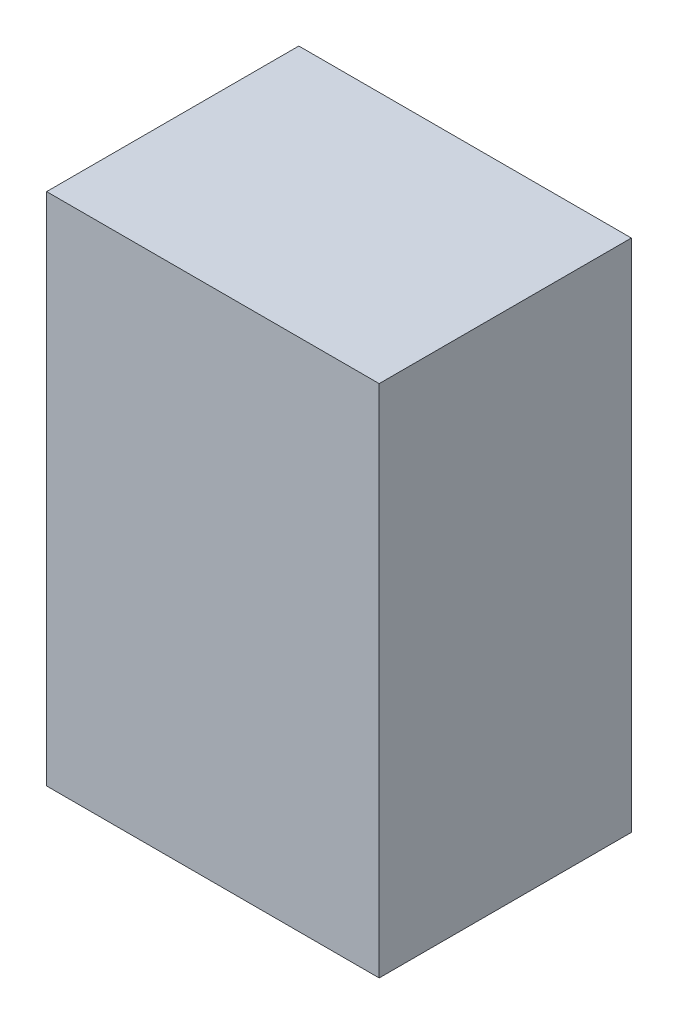
ISO-10303-21;
HEADER;
FILE_DESCRIPTION(('STEP AP214'),'2;1');
FILE_NAME('part.step','',(''),(''),'','','');
FILE_SCHEMA(('AUTOMOTIVE_DESIGN { 1 0 10303 214 1 1 1 1 }'));
ENDSEC;
DATA;
#1=APPLICATION_CONTEXT('core data for automotive mechanical design processes');
#2=APPLICATION_PROTOCOL_DEFINITION('international standard','automotive_design',2000,#1);
#3=PRODUCT_CONTEXT('',#1,'mechanical');
#4=PRODUCT('Part','Part','',(#3));
#5=PRODUCT_RELATED_PRODUCT_CATEGORY('part','',(#4));
#6=PRODUCT_DEFINITION_FORMATION('','',#4);
#7=PRODUCT_DEFINITION_CONTEXT('part definition',#1,'design');
#8=PRODUCT_DEFINITION('design','',#6,#7);
#9=PRODUCT_DEFINITION_SHAPE('','',#8);
#10=(LENGTH_UNIT() NAMED_UNIT(*) SI_UNIT(.MILLI.,.METRE.));
#11=(NAMED_UNIT(*) PLANE_ANGLE_UNIT() SI_UNIT($,.RADIAN.));
#12=(NAMED_UNIT(*) SI_UNIT($,.STERADIAN.) SOLID_ANGLE_UNIT());
#13=UNCERTAINTY_MEASURE_WITH_UNIT(LENGTH_MEASURE(1.E-05),#10,'distance_accuracy_value','');
#14=(GEOMETRIC_REPRESENTATION_CONTEXT(3) GLOBAL_UNCERTAINTY_ASSIGNED_CONTEXT((#13)) GLOBAL_UNIT_ASSIGNED_CONTEXT((#10,
#11,#12)) REPRESENTATION_CONTEXT('',''));
#15=CARTESIAN_POINT('',(0.,0.,0.));
#16=DIRECTION('',(0.,0.,1.));
#17=DIRECTION('',(1.,0.,0.));
#18=AXIS2_PLACEMENT_3D('',#15,#16,#17);
#19=CARTESIAN_POINT('',(-121.92,-188.722,184.912));
#20=DIRECTION('',(1.,0.,0.));
#21=DIRECTION('',(0.,0.,-1.));
#22=AXIS2_PLACEMENT_3D('',#19,#20,#21);
#23=PLANE('',#22);
#24=DIRECTION('',(0.,-1.,0.));
#25=VECTOR('',#24,1.);
#26=CARTESIAN_POINT('',(-121.92,-188.722,0.));
#27=LINE('',#26,#25);
#28=CARTESIAN_POINT('',(-121.92,188.722,0.));
#29=VERTEX_POINT('',#28);
#30=CARTESIAN_POINT('',(-121.92,-188.722,0.));
#31=VERTEX_POINT('',#30);
#32=EDGE_CURVE('E107',#29,#31,#27,.T.);
#33=ORIENTED_EDGE('',*,*,#32,.T.);
#34=DIRECTION('',(0.,0.,-1.));
#35=VECTOR('',#34,1.);
#36=CARTESIAN_POINT('',(-121.92,-188.722,184.912));
#37=LINE('',#36,#35);
#38=CARTESIAN_POINT('',(-121.92,-188.722,184.912));
#39=VERTEX_POINT('',#38);
#40=EDGE_CURVE('E11',#39,#31,#37,.T.);
#41=ORIENTED_EDGE('',*,*,#40,.F.);
#42=DIRECTION('',(0.,-1.,0.));
#43=VECTOR('',#42,1.);
#44=CARTESIAN_POINT('',(-121.92,-188.722,184.912));
#45=LINE('',#44,#43);
#46=CARTESIAN_POINT('',(-121.92,188.722,184.912));
#47=VERTEX_POINT('',#46);
#48=EDGE_CURVE('E91',#47,#39,#45,.T.);
#49=ORIENTED_EDGE('',*,*,#48,.F.);
#50=DIRECTION('',(0.,0.,-1.));
#51=VECTOR('',#50,1.);
#52=CARTESIAN_POINT('',(-121.92,188.722,184.912));
#53=LINE('',#52,#51);
#54=EDGE_CURVE('E103',#47,#29,#53,.T.);
#55=ORIENTED_EDGE('',*,*,#54,.T.);
#56=EDGE_LOOP('',(#33,#41,#49,#55));
#57=FACE_BOUND('',#56,.T.);
#58=ADVANCED_FACE('F39',(#57),#23,.F.);
#59=CARTESIAN_POINT('',(121.92,-188.722,184.912));
#60=DIRECTION('',(0.,1.,0.));
#61=DIRECTION('',(-1.,0.,0.));
#62=AXIS2_PLACEMENT_3D('',#59,#60,#61);
#63=PLANE('',#62);
#64=DIRECTION('',(1.,0.,0.));
#65=VECTOR('',#64,1.);
#66=CARTESIAN_POINT('',(121.92,-188.722,0.));
#67=LINE('',#66,#65);
#68=CARTESIAN_POINT('',(121.92,-188.722,0.));
#69=VERTEX_POINT('',#68);
#70=EDGE_CURVE('E96',#31,#69,#67,.T.);
#71=ORIENTED_EDGE('',*,*,#70,.T.);
#72=DIRECTION('',(0.,0.,-1.));
#73=VECTOR('',#72,1.);
#74=CARTESIAN_POINT('',(121.92,-188.722,184.912));
#75=LINE('',#74,#73);
#76=CARTESIAN_POINT('',(121.92,-188.722,184.912));
#77=VERTEX_POINT('',#76);
#78=EDGE_CURVE('E48',#77,#69,#75,.T.);
#79=ORIENTED_EDGE('',*,*,#78,.F.);
#80=DIRECTION('',(1.,0.,0.));
#81=VECTOR('',#80,1.);
#82=CARTESIAN_POINT('',(121.92,-188.722,184.912));
#83=LINE('',#82,#81);
#84=EDGE_CURVE('E86',#39,#77,#83,.T.);
#85=ORIENTED_EDGE('',*,*,#84,.F.);
#86=ORIENTED_EDGE('',*,*,#40,.T.);
#87=EDGE_LOOP('',(#71,#79,#85,#86));
#88=FACE_BOUND('',#87,.T.);
#89=ADVANCED_FACE('F95',(#88),#63,.F.);
#90=CARTESIAN_POINT('',(121.92,-188.722,184.912));
#91=DIRECTION('',(-1.,0.,0.));
#92=DIRECTION('',(0.,0.,1.));
#93=AXIS2_PLACEMENT_3D('',#90,#91,#92);
#94=PLANE('',#93);
#95=DIRECTION('',(0.,1.,0.));
#96=VECTOR('',#95,1.);
#97=CARTESIAN_POINT('',(121.92,-188.722,0.));
#98=LINE('',#97,#96);
#99=CARTESIAN_POINT('',(121.92,188.722,0.));
#100=VERTEX_POINT('',#99);
#101=EDGE_CURVE('E73',#69,#100,#98,.T.);
#102=ORIENTED_EDGE('',*,*,#101,.T.);
#103=DIRECTION('',(0.,0.,-1.));
#104=VECTOR('',#103,1.);
#105=CARTESIAN_POINT('',(121.92,188.722,184.912));
#106=LINE('',#105,#104);
#107=CARTESIAN_POINT('',(121.92,188.722,184.912));
#108=VERTEX_POINT('',#107);
#109=EDGE_CURVE('E98',#108,#100,#106,.T.);
#110=ORIENTED_EDGE('',*,*,#109,.F.);
#111=DIRECTION('',(0.,1.,0.));
#112=VECTOR('',#111,1.);
#113=CARTESIAN_POINT('',(121.92,-188.722,184.912));
#114=LINE('',#113,#112);
#115=EDGE_CURVE('E89',#77,#108,#114,.T.);
#116=ORIENTED_EDGE('',*,*,#115,.F.);
#117=ORIENTED_EDGE('',*,*,#78,.T.);
#118=EDGE_LOOP('',(#102,#110,#116,#117));
#119=FACE_BOUND('',#118,.T.);
#120=ADVANCED_FACE('F99',(#119),#94,.F.);
#121=CARTESIAN_POINT('',(121.92,188.722,184.912));
#122=DIRECTION('',(0.,-1.,0.));
#123=DIRECTION('',(1.,0.,0.));
#124=AXIS2_PLACEMENT_3D('',#121,#122,#123);
#125=PLANE('',#124);
#126=DIRECTION('',(-1.,0.,0.));
#127=VECTOR('',#126,1.);
#128=CARTESIAN_POINT('',(121.92,188.722,0.));
#129=LINE('',#128,#127);
#130=EDGE_CURVE('E79',#100,#29,#129,.T.);
#131=ORIENTED_EDGE('',*,*,#130,.T.);
#132=ORIENTED_EDGE('',*,*,#54,.F.);
#133=DIRECTION('',(-1.,0.,0.));
#134=VECTOR('',#133,1.);
#135=CARTESIAN_POINT('',(121.92,188.722,184.912));
#136=LINE('',#135,#134);
#137=EDGE_CURVE('E56',#108,#47,#136,.T.);
#138=ORIENTED_EDGE('',*,*,#137,.F.);
#139=ORIENTED_EDGE('',*,*,#109,.T.);
#140=EDGE_LOOP('',(#131,#132,#138,#139));
#141=FACE_BOUND('',#140,.T.);
#142=ADVANCED_FACE('F120',(#141),#125,.F.);
#143=CARTESIAN_POINT('',(0.,0.,184.912));
#144=DIRECTION('',(0.,0.,1.));
#145=DIRECTION('',(1.,0.,0.));
#146=AXIS2_PLACEMENT_3D('',#143,#144,#145);
#147=PLANE('',#146);
#148=ORIENTED_EDGE('',*,*,#48,.T.);
#149=ORIENTED_EDGE('',*,*,#84,.T.);
#150=ORIENTED_EDGE('',*,*,#115,.T.);
#151=ORIENTED_EDGE('',*,*,#137,.T.);
#152=EDGE_LOOP('',(#148,#149,#150,#151));
#153=FACE_BOUND('',#152,.T.);
#154=ADVANCED_FACE('F87',(#153),#147,.T.);
#155=CARTESIAN_POINT('',(0.,0.,0.));
#156=DIRECTION('',(0.,0.,1.));
#157=DIRECTION('',(1.,0.,0.));
#158=AXIS2_PLACEMENT_3D('',#155,#156,#157);
#159=PLANE('',#158);
#160=ORIENTED_EDGE('',*,*,#32,.F.);
#161=ORIENTED_EDGE('',*,*,#130,.F.);
#162=ORIENTED_EDGE('',*,*,#101,.F.);
#163=ORIENTED_EDGE('',*,*,#70,.F.);
#164=EDGE_LOOP('',(#160,#161,#162,#163));
#165=FACE_BOUND('',#164,.T.);
#166=ADVANCED_FACE('F123',(#165),#159,.F.);
#167=CLOSED_SHELL('',(#58,#89,#120,#142,#154,#166));
#168=MANIFOLD_SOLID_BREP('B2',#167);
#169=ADVANCED_BREP_SHAPE_REPRESENTATION('',(#18,#168),#14);
#170=SHAPE_DEFINITION_REPRESENTATION(#9,#169);
ENDSEC;
END-ISO-10303-21;
